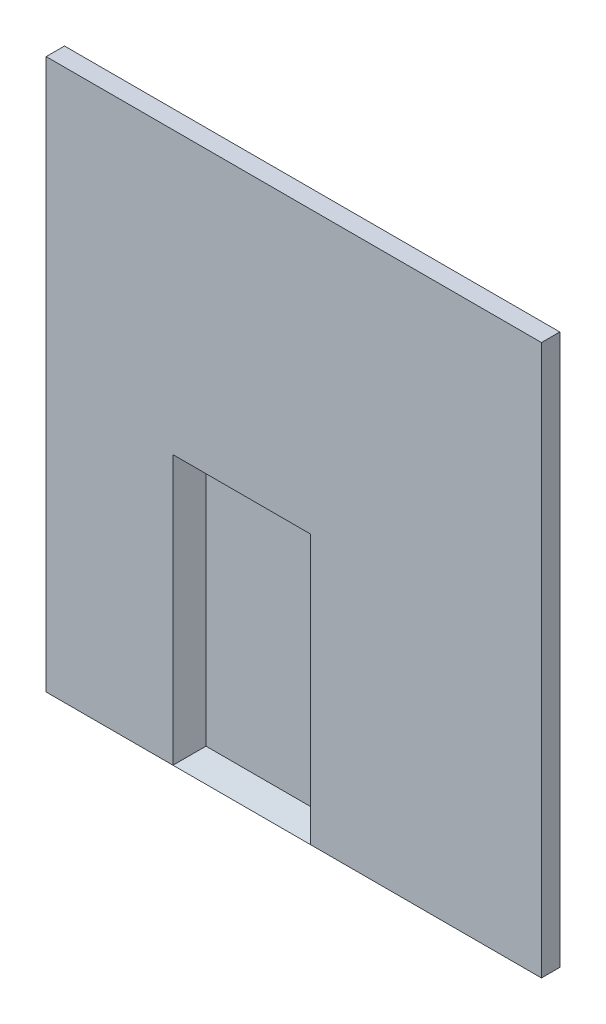
ISO-10303-21;
HEADER;
FILE_DESCRIPTION(('STEP AP214'),'2;1');
FILE_NAME('part.step','',(''),(''),'','','');
FILE_SCHEMA(('AUTOMOTIVE_DESIGN { 1 0 10303 214 1 1 1 1 }'));
ENDSEC;
DATA;
#1=APPLICATION_CONTEXT('core data for automotive mechanical design processes');
#2=APPLICATION_PROTOCOL_DEFINITION('international standard','automotive_design',2000,#1);
#3=PRODUCT_CONTEXT('',#1,'mechanical');
#4=PRODUCT('Part','Part','',(#3));
#5=PRODUCT_RELATED_PRODUCT_CATEGORY('part','',(#4));
#6=PRODUCT_DEFINITION_FORMATION('','',#4);
#7=PRODUCT_DEFINITION_CONTEXT('part definition',#1,'design');
#8=PRODUCT_DEFINITION('design','',#6,#7);
#9=PRODUCT_DEFINITION_SHAPE('','',#8);
#10=(LENGTH_UNIT() NAMED_UNIT(*) SI_UNIT(.MILLI.,.METRE.));
#11=(NAMED_UNIT(*) PLANE_ANGLE_UNIT() SI_UNIT($,.RADIAN.));
#12=(NAMED_UNIT(*) SI_UNIT($,.STERADIAN.) SOLID_ANGLE_UNIT());
#13=UNCERTAINTY_MEASURE_WITH_UNIT(LENGTH_MEASURE(1.E-05),#10,'distance_accuracy_value','');
#14=(GEOMETRIC_REPRESENTATION_CONTEXT(3) GLOBAL_UNCERTAINTY_ASSIGNED_CONTEXT((#13)) GLOBAL_UNIT_ASSIGNED_CONTEXT((#10,
#11,#12)) REPRESENTATION_CONTEXT('',''));
#15=CARTESIAN_POINT('',(0.,0.,0.));
#16=DIRECTION('',(0.,0.,1.));
#17=DIRECTION('',(1.,0.,0.));
#18=AXIS2_PLACEMENT_3D('',#15,#16,#17);
#19=CARTESIAN_POINT('',(135.,150.,10.));
#20=DIRECTION('',(0.,-1.,0.));
#21=DIRECTION('',(0.,0.,-1.));
#22=AXIS2_PLACEMENT_3D('',#19,#20,#21);
#23=PLANE('',#22);
#24=DIRECTION('',(-1.,0.,0.));
#25=VECTOR('',#24,1.);
#26=CARTESIAN_POINT('',(135.,150.,0.));
#27=LINE('',#26,#25);
#28=CARTESIAN_POINT('',(135.,150.,0.));
#29=VERTEX_POINT('',#28);
#30=CARTESIAN_POINT('',(-135.,150.,0.));
#31=VERTEX_POINT('',#30);
#32=EDGE_CURVE('E145',#29,#31,#27,.T.);
#33=ORIENTED_EDGE('',*,*,#32,.T.);
#34=DIRECTION('',(0.,0.,-1.));
#35=VECTOR('',#34,1.);
#36=CARTESIAN_POINT('',(-135.,150.,10.));
#37=LINE('',#36,#35);
#38=CARTESIAN_POINT('',(-135.,150.,10.));
#39=VERTEX_POINT('',#38);
#40=EDGE_CURVE('E11',#39,#31,#37,.T.);
#41=ORIENTED_EDGE('',*,*,#40,.F.);
#42=DIRECTION('',(-1.,0.,0.));
#43=VECTOR('',#42,1.);
#44=CARTESIAN_POINT('',(135.,150.,10.));
#45=LINE('',#44,#43);
#46=CARTESIAN_POINT('',(135.,150.,10.));
#47=VERTEX_POINT('',#46);
#48=EDGE_CURVE('E84',#47,#39,#45,.T.);
#49=ORIENTED_EDGE('',*,*,#48,.F.);
#50=DIRECTION('',(0.,0.,-1.));
#51=VECTOR('',#50,1.);
#52=CARTESIAN_POINT('',(135.,150.,10.));
#53=LINE('',#52,#51);
#54=EDGE_CURVE('E139',#47,#29,#53,.T.);
#55=ORIENTED_EDGE('',*,*,#54,.T.);
#56=EDGE_LOOP('',(#33,#41,#49,#55));
#57=FACE_BOUND('',#56,.T.);
#58=ADVANCED_FACE('F36',(#57),#23,.F.);
#59=CARTESIAN_POINT('',(-135.,-150.,10.));
#60=DIRECTION('',(-1.,0.,0.));
#61=DIRECTION('',(0.,0.,1.));
#62=AXIS2_PLACEMENT_3D('',#59,#60,#61);
#63=PLANE('',#62);
#64=DIRECTION('',(0.,1.,0.));
#65=VECTOR('',#64,1.);
#66=CARTESIAN_POINT('',(-135.,-150.,0.));
#67=LINE('',#66,#65);
#68=CARTESIAN_POINT('',(-135.,-150.,0.));
#69=VERTEX_POINT('',#68);
#70=EDGE_CURVE('E148',#69,#31,#67,.T.);
#71=ORIENTED_EDGE('',*,*,#70,.F.);
#72=DIRECTION('',(0.,0.,-1.));
#73=VECTOR('',#72,1.);
#74=CARTESIAN_POINT('',(-135.,-150.,10.));
#75=LINE('',#74,#73);
#76=CARTESIAN_POINT('',(-135.,-150.,10.));
#77=VERTEX_POINT('',#76);
#78=EDGE_CURVE('E43',#77,#69,#75,.T.);
#79=ORIENTED_EDGE('',*,*,#78,.F.);
#80=DIRECTION('',(0.,1.,0.));
#81=VECTOR('',#80,1.);
#82=CARTESIAN_POINT('',(-135.,-150.,10.));
#83=LINE('',#82,#81);
#84=EDGE_CURVE('E141',#77,#39,#83,.T.);
#85=ORIENTED_EDGE('',*,*,#84,.T.);
#86=ORIENTED_EDGE('',*,*,#40,.T.);
#87=EDGE_LOOP('',(#71,#79,#85,#86));
#88=FACE_BOUND('',#87,.T.);
#89=ADVANCED_FACE('F161',(#88),#63,.T.);
#90=CARTESIAN_POINT('',(135.,-150.,10.));
#91=DIRECTION('',(0.,-1.,0.));
#92=DIRECTION('',(0.,0.,-1.));
#93=AXIS2_PLACEMENT_3D('',#90,#91,#92);
#94=PLANE('',#93);
#95=DIRECTION('',(-1.,0.,0.));
#96=VECTOR('',#95,1.);
#97=CARTESIAN_POINT('',(135.,-150.,0.));
#98=LINE('',#97,#96);
#99=CARTESIAN_POINT('',(135.,-150.,0.));
#100=VERTEX_POINT('',#99);
#101=EDGE_CURVE('E152',#100,#69,#98,.T.);
#102=ORIENTED_EDGE('',*,*,#101,.F.);
#103=DIRECTION('',(0.,0.,-1.));
#104=VECTOR('',#103,1.);
#105=CARTESIAN_POINT('',(135.,-150.,10.));
#106=LINE('',#105,#104);
#107=CARTESIAN_POINT('',(135.,-150.,10.));
#108=VERTEX_POINT('',#107);
#109=EDGE_CURVE('E136',#108,#100,#106,.T.);
#110=ORIENTED_EDGE('',*,*,#109,.F.);
#111=DIRECTION('',(-1.,0.,0.));
#112=VECTOR('',#111,1.);
#113=CARTESIAN_POINT('',(135.,-150.,10.));
#114=LINE('',#113,#112);
#115=CARTESIAN_POINT('',(9.10999999999997,-150.,10.));
#116=VERTEX_POINT('',#115);
#117=EDGE_CURVE('E130',#108,#116,#114,.T.);
#118=ORIENTED_EDGE('',*,*,#117,.T.);
#119=DIRECTION('',(1.,0.,0.));
#120=VECTOR('',#119,1.);
#121=CARTESIAN_POINT('',(-65.89,-150.,10.));
#122=LINE('',#121,#120);
#123=CARTESIAN_POINT('',(-65.89,-150.,10.));
#124=VERTEX_POINT('',#123);
#125=EDGE_CURVE('E123',#124,#116,#122,.T.);
#126=ORIENTED_EDGE('',*,*,#125,.F.);
#127=EDGE_CURVE('E137',#124,#77,#114,.T.);
#128=ORIENTED_EDGE('',*,*,#127,.T.);
#129=ORIENTED_EDGE('',*,*,#78,.T.);
#130=EDGE_LOOP('',(#102,#110,#118,#126,#128,#129));
#131=FACE_BOUND('',#130,.T.);
#132=ADVANCED_FACE('F135',(#131),#94,.T.);
#133=CARTESIAN_POINT('',(135.,-150.,10.));
#134=DIRECTION('',(-1.,0.,0.));
#135=DIRECTION('',(0.,0.,1.));
#136=AXIS2_PLACEMENT_3D('',#133,#134,#135);
#137=PLANE('',#136);
#138=DIRECTION('',(0.,1.,0.));
#139=VECTOR('',#138,1.);
#140=CARTESIAN_POINT('',(135.,-150.,0.));
#141=LINE('',#140,#139);
#142=EDGE_CURVE('E79',#100,#29,#141,.T.);
#143=ORIENTED_EDGE('',*,*,#142,.T.);
#144=ORIENTED_EDGE('',*,*,#54,.F.);
#145=DIRECTION('',(0.,1.,0.));
#146=VECTOR('',#145,1.);
#147=CARTESIAN_POINT('',(135.,-150.,10.));
#148=LINE('',#147,#146);
#149=EDGE_CURVE('E59',#108,#47,#148,.T.);
#150=ORIENTED_EDGE('',*,*,#149,.F.);
#151=ORIENTED_EDGE('',*,*,#109,.T.);
#152=EDGE_LOOP('',(#143,#144,#150,#151));
#153=FACE_BOUND('',#152,.T.);
#154=ADVANCED_FACE('F166',(#153),#137,.F.);
#155=CARTESIAN_POINT('',(0.,0.,10.));
#156=DIRECTION('',(0.,0.,-1.));
#157=DIRECTION('',(-1.,0.,0.));
#158=AXIS2_PLACEMENT_3D('',#155,#156,#157);
#159=PLANE('',#158);
#160=ORIENTED_EDGE('',*,*,#127,.F.);
#161=DIRECTION('',(0.,-1.,0.));
#162=VECTOR('',#161,1.);
#163=CARTESIAN_POINT('',(-65.89,-150.,10.));
#164=LINE('',#163,#162);
#165=CARTESIAN_POINT('',(-65.89,-3.35000000000002,10.));
#166=VERTEX_POINT('',#165);
#167=EDGE_CURVE('E50',#166,#124,#164,.T.);
#168=ORIENTED_EDGE('',*,*,#167,.F.);
#169=DIRECTION('',(-1.,0.,0.));
#170=VECTOR('',#169,1.);
#171=CARTESIAN_POINT('',(-65.89,-3.35000000000002,10.));
#172=LINE('',#171,#170);
#173=CARTESIAN_POINT('',(9.10999999999997,-3.35000000000002,10.));
#174=VERTEX_POINT('',#173);
#175=EDGE_CURVE('E132',#174,#166,#172,.T.);
#176=ORIENTED_EDGE('',*,*,#175,.F.);
#177=DIRECTION('',(0.,1.,0.));
#178=VECTOR('',#177,1.);
#179=CARTESIAN_POINT('',(9.10999999999997,-150.,10.));
#180=LINE('',#179,#178);
#181=EDGE_CURVE('E112',#116,#174,#180,.T.);
#182=ORIENTED_EDGE('',*,*,#181,.F.);
#183=ORIENTED_EDGE('',*,*,#117,.F.);
#184=ORIENTED_EDGE('',*,*,#149,.T.);
#185=ORIENTED_EDGE('',*,*,#48,.T.);
#186=ORIENTED_EDGE('',*,*,#84,.F.);
#187=EDGE_LOOP('',(#160,#168,#176,#182,#183,#184,#185,#186));
#188=FACE_BOUND('',#187,.T.);
#189=ADVANCED_FACE('F129',(#188),#159,.F.);
#190=CARTESIAN_POINT('',(0.,0.,0.));
#191=DIRECTION('',(0.,0.,-1.));
#192=DIRECTION('',(-1.,0.,0.));
#193=AXIS2_PLACEMENT_3D('',#190,#191,#192);
#194=PLANE('',#193);
#195=ORIENTED_EDGE('',*,*,#32,.F.);
#196=ORIENTED_EDGE('',*,*,#142,.F.);
#197=ORIENTED_EDGE('',*,*,#101,.T.);
#198=ORIENTED_EDGE('',*,*,#70,.T.);
#199=EDGE_LOOP('',(#195,#196,#197,#198));
#200=FACE_BOUND('',#199,.T.);
#201=ADVANCED_FACE('F164',(#200),#194,.T.);
#202=CARTESIAN_POINT('',(-65.89,-150.,10.));
#203=DIRECTION('',(-0.707106781186546,0.,-0.707106781186549));
#204=DIRECTION('',(-0.707106781186549,0.,0.707106781186546));
#205=AXIS2_PLACEMENT_3D('',#202,#203,#204);
#206=PLANE('',#205);
#207=ORIENTED_EDGE('',*,*,#167,.T.);
#208=DIRECTION('',(-0.577350269189627,-0.577350269189627,0.577350269189624));
#209=VECTOR('',#208,1.);
#210=CARTESIAN_POINT('',(-65.89,-150.,10.));
#211=LINE('',#210,#209);
#212=CARTESIAN_POINT('',(-56.89,-141.,1.));
#213=VERTEX_POINT('',#212);
#214=EDGE_CURVE('E120',#213,#124,#211,.T.);
#215=ORIENTED_EDGE('',*,*,#214,.F.);
#216=DIRECTION('',(0.,-1.,0.));
#217=VECTOR('',#216,1.);
#218=CARTESIAN_POINT('',(-56.89,-150.,1.));
#219=LINE('',#218,#217);
#220=CARTESIAN_POINT('',(-56.89,-12.3500000000001,1.));
#221=VERTEX_POINT('',#220);
#222=EDGE_CURVE('E250',#221,#213,#219,.T.);
#223=ORIENTED_EDGE('',*,*,#222,.F.);
#224=DIRECTION('',(-0.577350269189627,0.577350269189627,0.577350269189624));
#225=VECTOR('',#224,1.);
#226=CARTESIAN_POINT('',(-65.89,-3.35000000000002,10.));
#227=LINE('',#226,#225);
#228=EDGE_CURVE('E149',#221,#166,#227,.T.);
#229=ORIENTED_EDGE('',*,*,#228,.T.);
#230=EDGE_LOOP('',(#207,#215,#223,#229));
#231=FACE_BOUND('',#230,.T.);
#232=ADVANCED_FACE('F202',(#231),#206,.F.);
#233=CARTESIAN_POINT('',(-65.89,-3.35000000000002,10.));
#234=DIRECTION('',(0.,0.707106781186546,-0.707106781186549));
#235=DIRECTION('',(0.,0.707106781186549,0.707106781186546));
#236=AXIS2_PLACEMENT_3D('',#233,#234,#235);
#237=PLANE('',#236);
#238=ORIENTED_EDGE('',*,*,#175,.T.);
#239=ORIENTED_EDGE('',*,*,#228,.F.);
#240=DIRECTION('',(-1.,0.,0.));
#241=VECTOR('',#240,1.);
#242=CARTESIAN_POINT('',(-65.89,-12.3500000000001,1.));
#243=LINE('',#242,#241);
#244=CARTESIAN_POINT('',(0.109999999999933,-12.3500000000001,1.));
#245=VERTEX_POINT('',#244);
#246=EDGE_CURVE('E253',#245,#221,#243,.T.);
#247=ORIENTED_EDGE('',*,*,#246,.F.);
#248=DIRECTION('',(0.577350269189627,0.577350269189627,0.577350269189624));
#249=VECTOR('',#248,1.);
#250=CARTESIAN_POINT('',(-39.7733333333335,-52.2333333333335,-38.8833333333333));
#251=LINE('',#250,#249);
#252=EDGE_CURVE('E119',#245,#174,#251,.T.);
#253=ORIENTED_EDGE('',*,*,#252,.T.);
#254=EDGE_LOOP('',(#238,#239,#247,#253));
#255=FACE_BOUND('',#254,.T.);
#256=ADVANCED_FACE('F207',(#255),#237,.F.);
#257=CARTESIAN_POINT('',(9.10999999999997,-150.,10.));
#258=DIRECTION('',(0.707106781186546,0.,-0.707106781186549));
#259=DIRECTION('',(-0.707106781186549,0.,-0.707106781186546));
#260=AXIS2_PLACEMENT_3D('',#257,#258,#259);
#261=PLANE('',#260);
#262=ORIENTED_EDGE('',*,*,#181,.T.);
#263=ORIENTED_EDGE('',*,*,#252,.F.);
#264=DIRECTION('',(0.,1.,0.));
#265=VECTOR('',#264,1.);
#266=CARTESIAN_POINT('',(0.109999999999933,-150.,1.));
#267=LINE('',#266,#265);
#268=CARTESIAN_POINT('',(0.109999999999933,-141.,1.));
#269=VERTEX_POINT('',#268);
#270=EDGE_CURVE('E115',#269,#245,#267,.T.);
#271=ORIENTED_EDGE('',*,*,#270,.F.);
#272=DIRECTION('',(0.577350269189627,-0.577350269189627,0.577350269189624));
#273=VECTOR('',#272,1.);
#274=CARTESIAN_POINT('',(-15.8900000000001,-125.,-15.));
#275=LINE('',#274,#273);
#276=EDGE_CURVE('E108',#269,#116,#275,.T.);
#277=ORIENTED_EDGE('',*,*,#276,.T.);
#278=EDGE_LOOP('',(#262,#263,#271,#277));
#279=FACE_BOUND('',#278,.T.);
#280=ADVANCED_FACE('F110',(#279),#261,.F.);
#281=CARTESIAN_POINT('',(-65.89,-150.,10.));
#282=DIRECTION('',(0.,-0.707106781186546,-0.707106781186549));
#283=DIRECTION('',(0.,0.707106781186549,-0.707106781186546));
#284=AXIS2_PLACEMENT_3D('',#281,#282,#283);
#285=PLANE('',#284);
#286=ORIENTED_EDGE('',*,*,#125,.T.);
#287=ORIENTED_EDGE('',*,*,#276,.F.);
#288=DIRECTION('',(1.,0.,0.));
#289=VECTOR('',#288,1.);
#290=CARTESIAN_POINT('',(-65.89,-141.,1.));
#291=LINE('',#290,#289);
#292=EDGE_CURVE('E251',#213,#269,#291,.T.);
#293=ORIENTED_EDGE('',*,*,#292,.F.);
#294=ORIENTED_EDGE('',*,*,#214,.T.);
#295=EDGE_LOOP('',(#286,#287,#293,#294));
#296=FACE_BOUND('',#295,.T.);
#297=ADVANCED_FACE('F124',(#296),#285,.F.);
#298=CARTESIAN_POINT('',(0.,0.,1.));
#299=DIRECTION('',(0.,0.,-1.));
#300=DIRECTION('',(-1.,0.,0.));
#301=AXIS2_PLACEMENT_3D('',#298,#299,#300);
#302=PLANE('',#301);
#303=ORIENTED_EDGE('',*,*,#222,.T.);
#304=ORIENTED_EDGE('',*,*,#292,.T.);
#305=ORIENTED_EDGE('',*,*,#270,.T.);
#306=ORIENTED_EDGE('',*,*,#246,.T.);
#307=EDGE_LOOP('',(#303,#304,#305,#306));
#308=FACE_BOUND('',#307,.T.);
#309=ADVANCED_FACE('F233',(#308),#302,.F.);
#310=CLOSED_SHELL('',(#58,#89,#132,#154,#189,#201,#232,#256,#280,#297,#309));
#311=MANIFOLD_SOLID_BREP('B2',#310);
#312=ADVANCED_BREP_SHAPE_REPRESENTATION('',(#18,#311),#14);
#313=SHAPE_DEFINITION_REPRESENTATION(#9,#312);
ENDSEC;
END-ISO-10303-21;
